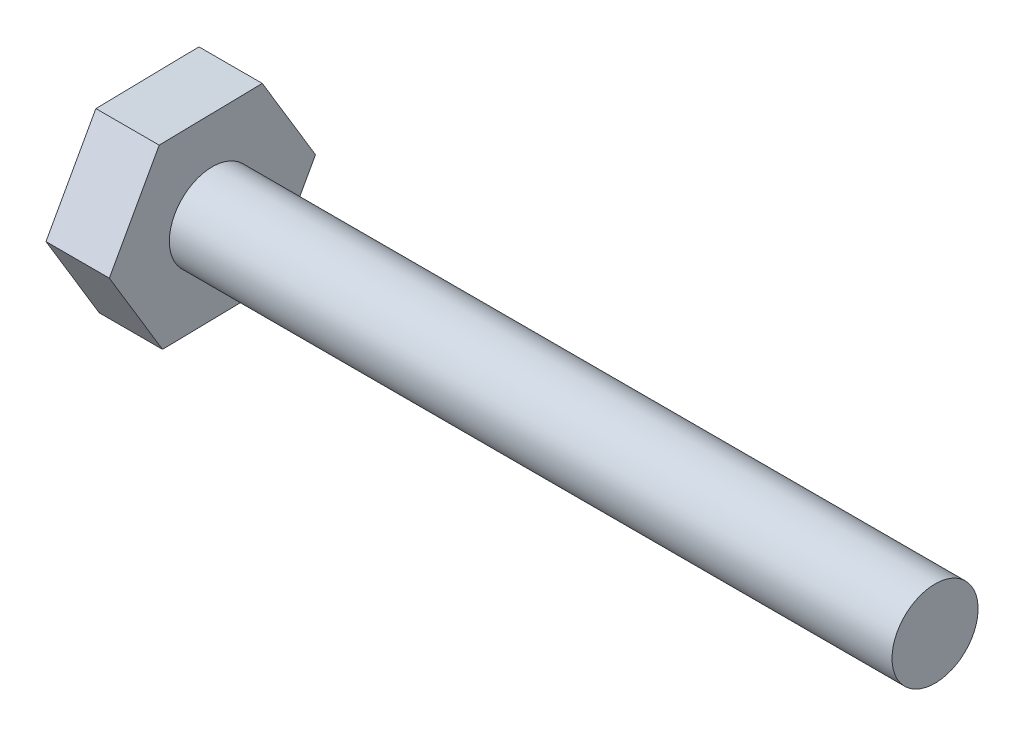
ISO-10303-21;
HEADER;
FILE_DESCRIPTION(('STEP AP214'),'2;1');
FILE_NAME('part.step','',(''),(''),'','','');
FILE_SCHEMA(('AUTOMOTIVE_DESIGN { 1 0 10303 214 1 1 1 1 }'));
ENDSEC;
DATA;
#1=APPLICATION_CONTEXT('core data for automotive mechanical design processes');
#2=APPLICATION_PROTOCOL_DEFINITION('international standard','automotive_design',2000,#1);
#3=PRODUCT_CONTEXT('',#1,'mechanical');
#4=PRODUCT('Part','Part','',(#3));
#5=PRODUCT_RELATED_PRODUCT_CATEGORY('part','',(#4));
#6=PRODUCT_DEFINITION_FORMATION('','',#4);
#7=PRODUCT_DEFINITION_CONTEXT('part definition',#1,'design');
#8=PRODUCT_DEFINITION('design','',#6,#7);
#9=PRODUCT_DEFINITION_SHAPE('','',#8);
#10=(LENGTH_UNIT() NAMED_UNIT(*) SI_UNIT(.MILLI.,.METRE.));
#11=(NAMED_UNIT(*) PLANE_ANGLE_UNIT() SI_UNIT($,.RADIAN.));
#12=(NAMED_UNIT(*) SI_UNIT($,.STERADIAN.) SOLID_ANGLE_UNIT());
#13=UNCERTAINTY_MEASURE_WITH_UNIT(LENGTH_MEASURE(1.E-05),#10,'distance_accuracy_value','');
#14=(GEOMETRIC_REPRESENTATION_CONTEXT(3) GLOBAL_UNCERTAINTY_ASSIGNED_CONTEXT((#13)) GLOBAL_UNIT_ASSIGNED_CONTEXT((#10,
#11,#12)) REPRESENTATION_CONTEXT('',''));
#15=CARTESIAN_POINT('',(0.,0.,0.));
#16=DIRECTION('',(0.,0.,1.));
#17=DIRECTION('',(1.,0.,0.));
#18=AXIS2_PLACEMENT_3D('',#15,#16,#17);
#19=CARTESIAN_POINT('',(0.,0.,0.));
#20=DIRECTION('',(1.,0.,0.));
#21=DIRECTION('',(0.,0.,-1.));
#22=AXIS2_PLACEMENT_3D('',#19,#20,#21);
#23=PLANE('',#22);
#24=DIRECTION('',(0.,-0.856501290352966,-0.51614488239612));
#25=VECTOR('',#24,1.);
#26=CARTESIAN_POINT('',(0.,-3.57688403500511,5.93555394214605));
#27=LINE('',#26,#25);
#28=CARTESIAN_POINT('',(0.,-0.149990368717544,8.00066890261633));
#29=VERTEX_POINT('',#28);
#30=CARTESIAN_POINT('',(0.,-7.00377770129268,3.87043898167577));
#31=VERTEX_POINT('',#30);
#32=EDGE_CURVE('E203',#29,#31,#27,.T.);
#33=ORIENTED_EDGE('',*,*,#32,.F.);
#34=DIRECTION('',(0.,-0.875245225364854,0.48367943462176));
#35=VECTOR('',#34,1.);
#36=CARTESIAN_POINT('',(0.,3.35189848192879,6.06544941177844));
#37=LINE('',#36,#35);
#38=CARTESIAN_POINT('',(0.,6.85378733257514,4.13022992094055));
#39=VERTEX_POINT('',#38);
#40=EDGE_CURVE('E164',#39,#29,#37,.T.);
#41=ORIENTED_EDGE('',*,*,#40,.F.);
#42=DIRECTION('',(0.,-0.0187439350118885,0.99982431701788));
#43=VECTOR('',#42,1.);
#44=CARTESIAN_POINT('',(0.,6.92878251693391,0.129895469632387));
#45=LINE('',#44,#43);
#46=CARTESIAN_POINT('',(0.,7.00377770129268,-3.87043898167577));
#47=VERTEX_POINT('',#46);
#48=EDGE_CURVE('E158',#47,#39,#45,.T.);
#49=ORIENTED_EDGE('',*,*,#48,.F.);
#50=DIRECTION('',(0.,0.856501290352966,0.51614488239612));
#51=VECTOR('',#50,1.);
#52=CARTESIAN_POINT('',(0.,3.57688403500511,-5.93555394214605));
#53=LINE('',#52,#51);
#54=CARTESIAN_POINT('',(0.,0.149990368717546,-8.00066890261633));
#55=VERTEX_POINT('',#54);
#56=EDGE_CURVE('E193',#55,#47,#53,.T.);
#57=ORIENTED_EDGE('',*,*,#56,.F.);
#58=DIRECTION('',(0.,0.875245225364855,-0.483679434621759));
#59=VECTOR('',#58,1.);
#60=CARTESIAN_POINT('',(0.,-3.35189848192879,-6.06544941177844));
#61=LINE('',#60,#59);
#62=CARTESIAN_POINT('',(0.,-6.85378733257513,-4.13022992094056));
#63=VERTEX_POINT('',#62);
#64=EDGE_CURVE('E208',#63,#55,#61,.T.);
#65=ORIENTED_EDGE('',*,*,#64,.F.);
#66=DIRECTION('',(0.,0.0187439350118889,-0.99982431701788));
#67=VECTOR('',#66,1.);
#68=CARTESIAN_POINT('',(0.,-6.92878251693391,-0.12989546963239));
#69=LINE('',#68,#67);
#70=EDGE_CURVE('E206',#31,#63,#69,.T.);
#71=ORIENTED_EDGE('',*,*,#70,.F.);
#72=EDGE_LOOP('',(#33,#41,#49,#57,#65,#71));
#73=FACE_BOUND('',#72,.T.);
#74=ADVANCED_FACE('F117',(#73),#23,.F.);
#75=CARTESIAN_POINT('',(4.91383112753295,-6.92878251693391,-0.12989546963239));
#76=DIRECTION('',(0.,0.99982431701788,0.0187439350118888));
#77=DIRECTION('',(0.,-0.0187439350118888,0.99982431701788));
#78=AXIS2_PLACEMENT_3D('',#75,#76,#77);
#79=PLANE('',#78);
#80=ORIENTED_EDGE('',*,*,#70,.T.);
#81=DIRECTION('',(-1.,0.,0.));
#82=VECTOR('',#81,1.);
#83=CARTESIAN_POINT('',(4.91383112753295,-6.85378733257513,-4.13022992094056));
#84=LINE('',#83,#82);
#85=CARTESIAN_POINT('',(4.91383112753295,-6.85378733257513,-4.13022992094056));
#86=VERTEX_POINT('',#85);
#87=EDGE_CURVE('E127',#86,#63,#84,.T.);
#88=ORIENTED_EDGE('',*,*,#87,.F.);
#89=DIRECTION('',(0.,0.0187439350118889,-0.99982431701788));
#90=VECTOR('',#89,1.);
#91=CARTESIAN_POINT('',(4.91383112753295,-6.92878251693391,-0.12989546963239));
#92=LINE('',#91,#90);
#93=CARTESIAN_POINT('',(4.91383112753295,-7.00377770129268,3.87043898167577));
#94=VERTEX_POINT('',#93);
#95=EDGE_CURVE('E172',#94,#86,#92,.T.);
#96=ORIENTED_EDGE('',*,*,#95,.F.);
#97=DIRECTION('',(-1.,0.,0.));
#98=VECTOR('',#97,1.);
#99=CARTESIAN_POINT('',(4.91383112753295,-7.00377770129268,3.87043898167577));
#100=LINE('',#99,#98);
#101=EDGE_CURVE('E12',#94,#31,#100,.T.);
#102=ORIENTED_EDGE('',*,*,#101,.T.);
#103=EDGE_LOOP('',(#80,#88,#96,#102));
#104=FACE_BOUND('',#103,.T.);
#105=ADVANCED_FACE('F247',(#104),#79,.F.);
#106=CARTESIAN_POINT('',(4.91383112753295,-3.35189848192879,-6.06544941177844));
#107=DIRECTION('',(0.,0.483679434621759,0.875245225364855));
#108=DIRECTION('',(0.,-0.875245225364855,0.483679434621759));
#109=AXIS2_PLACEMENT_3D('',#106,#107,#108);
#110=PLANE('',#109);
#111=ORIENTED_EDGE('',*,*,#64,.T.);
#112=DIRECTION('',(-1.,0.,0.));
#113=VECTOR('',#112,1.);
#114=CARTESIAN_POINT('',(4.91383112753295,0.149990368717546,-8.00066890261633));
#115=LINE('',#114,#113);
#116=CARTESIAN_POINT('',(4.91383112753295,0.149990368717546,-8.00066890261633));
#117=VERTEX_POINT('',#116);
#118=EDGE_CURVE('E194',#117,#55,#115,.T.);
#119=ORIENTED_EDGE('',*,*,#118,.F.);
#120=DIRECTION('',(0.,0.875245225364855,-0.483679434621759));
#121=VECTOR('',#120,1.);
#122=CARTESIAN_POINT('',(4.91383112753295,-3.35189848192879,-6.06544941177844));
#123=LINE('',#122,#121);
#124=EDGE_CURVE('E185',#86,#117,#123,.T.);
#125=ORIENTED_EDGE('',*,*,#124,.F.);
#126=ORIENTED_EDGE('',*,*,#87,.T.);
#127=EDGE_LOOP('',(#111,#119,#125,#126));
#128=FACE_BOUND('',#127,.T.);
#129=ADVANCED_FACE('F220',(#128),#110,.F.);
#130=CARTESIAN_POINT('',(4.91383112753295,3.57688403500511,-5.93555394214605));
#131=DIRECTION('',(0.,-0.51614488239612,0.856501290352966));
#132=DIRECTION('',(0.,-0.856501290352966,-0.51614488239612));
#133=AXIS2_PLACEMENT_3D('',#130,#131,#132);
#134=PLANE('',#133);
#135=ORIENTED_EDGE('',*,*,#56,.T.);
#136=DIRECTION('',(-1.,0.,0.));
#137=VECTOR('',#136,1.);
#138=CARTESIAN_POINT('',(4.91383112753295,7.00377770129268,-3.87043898167577));
#139=LINE('',#138,#137);
#140=CARTESIAN_POINT('',(4.91383112753295,7.00377770129268,-3.87043898167577));
#141=VERTEX_POINT('',#140);
#142=EDGE_CURVE('E190',#141,#47,#139,.T.);
#143=ORIENTED_EDGE('',*,*,#142,.F.);
#144=DIRECTION('',(0.,0.856501290352966,0.51614488239612));
#145=VECTOR('',#144,1.);
#146=CARTESIAN_POINT('',(4.91383112753295,3.57688403500511,-5.93555394214605));
#147=LINE('',#146,#145);
#148=EDGE_CURVE('E179',#117,#141,#147,.T.);
#149=ORIENTED_EDGE('',*,*,#148,.F.);
#150=ORIENTED_EDGE('',*,*,#118,.T.);
#151=EDGE_LOOP('',(#135,#143,#149,#150));
#152=FACE_BOUND('',#151,.T.);
#153=ADVANCED_FACE('F191',(#152),#134,.F.);
#154=CARTESIAN_POINT('',(4.91383112753295,6.92878251693391,0.129895469632387));
#155=DIRECTION('',(0.,-0.99982431701788,-0.0187439350118885));
#156=DIRECTION('',(0.,0.0187439350118885,-0.99982431701788));
#157=AXIS2_PLACEMENT_3D('',#154,#155,#156);
#158=PLANE('',#157);
#159=ORIENTED_EDGE('',*,*,#48,.T.);
#160=DIRECTION('',(-1.,0.,0.));
#161=VECTOR('',#160,1.);
#162=CARTESIAN_POINT('',(4.91383112753295,6.85378733257514,4.13022992094055));
#163=LINE('',#162,#161);
#164=CARTESIAN_POINT('',(4.91383112753295,6.85378733257514,4.13022992094055));
#165=VERTEX_POINT('',#164);
#166=EDGE_CURVE('E195',#165,#39,#163,.T.);
#167=ORIENTED_EDGE('',*,*,#166,.F.);
#168=DIRECTION('',(0.,-0.0187439350118885,0.99982431701788));
#169=VECTOR('',#168,1.);
#170=CARTESIAN_POINT('',(4.91383112753295,6.92878251693391,0.129895469632387));
#171=LINE('',#170,#169);
#172=EDGE_CURVE('E183',#141,#165,#171,.T.);
#173=ORIENTED_EDGE('',*,*,#172,.F.);
#174=ORIENTED_EDGE('',*,*,#142,.T.);
#175=EDGE_LOOP('',(#159,#167,#173,#174));
#176=FACE_BOUND('',#175,.T.);
#177=ADVANCED_FACE('F197',(#176),#158,.F.);
#178=CARTESIAN_POINT('',(4.91383112753295,3.35189848192879,6.06544941177844));
#179=DIRECTION('',(0.,-0.48367943462176,-0.875245225364854));
#180=DIRECTION('',(0.,0.875245225364855,-0.48367943462176));
#181=AXIS2_PLACEMENT_3D('',#178,#179,#180);
#182=PLANE('',#181);
#183=ORIENTED_EDGE('',*,*,#40,.T.);
#184=DIRECTION('',(-1.,0.,0.));
#185=VECTOR('',#184,1.);
#186=CARTESIAN_POINT('',(4.91383112753295,-0.149990368717544,8.00066890261633));
#187=LINE('',#186,#185);
#188=CARTESIAN_POINT('',(4.91383112753295,-0.149990368717544,8.00066890261633));
#189=VERTEX_POINT('',#188);
#190=EDGE_CURVE('E199',#189,#29,#187,.T.);
#191=ORIENTED_EDGE('',*,*,#190,.F.);
#192=DIRECTION('',(0.,-0.875245225364854,0.48367943462176));
#193=VECTOR('',#192,1.);
#194=CARTESIAN_POINT('',(4.91383112753295,3.35189848192879,6.06544941177844));
#195=LINE('',#194,#193);
#196=EDGE_CURVE('E135',#165,#189,#195,.T.);
#197=ORIENTED_EDGE('',*,*,#196,.F.);
#198=ORIENTED_EDGE('',*,*,#166,.T.);
#199=EDGE_LOOP('',(#183,#191,#197,#198));
#200=FACE_BOUND('',#199,.T.);
#201=ADVANCED_FACE('F226',(#200),#182,.F.);
#202=CARTESIAN_POINT('',(4.91383112753295,-3.57688403500511,5.93555394214605));
#203=DIRECTION('',(0.,0.51614488239612,-0.856501290352966));
#204=DIRECTION('',(0.,0.856501290352966,0.51614488239612));
#205=AXIS2_PLACEMENT_3D('',#202,#203,#204);
#206=PLANE('',#205);
#207=ORIENTED_EDGE('',*,*,#32,.T.);
#208=ORIENTED_EDGE('',*,*,#101,.F.);
#209=DIRECTION('',(0.,-0.856501290352966,-0.51614488239612));
#210=VECTOR('',#209,1.);
#211=CARTESIAN_POINT('',(4.91383112753295,-3.57688403500511,5.93555394214605));
#212=LINE('',#211,#210);
#213=EDGE_CURVE('E213',#189,#94,#212,.T.);
#214=ORIENTED_EDGE('',*,*,#213,.F.);
#215=ORIENTED_EDGE('',*,*,#190,.T.);
#216=EDGE_LOOP('',(#207,#208,#214,#215));
#217=FACE_BOUND('',#216,.T.);
#218=ADVANCED_FACE('F119',(#217),#206,.F.);
#219=CARTESIAN_POINT('',(4.91383112753295,0.,0.));
#220=DIRECTION('',(1.,0.,0.));
#221=DIRECTION('',(0.,0.,-1.));
#222=AXIS2_PLACEMENT_3D('',#219,#220,#221);
#223=PLANE('',#222);
#224=CARTESIAN_POINT('',(4.91383112753295,0.,0.));
#225=DIRECTION('',(1.,0.,0.));
#226=DIRECTION('',(0.,0.,-1.));
#227=AXIS2_PLACEMENT_3D('',#224,#225,#226);
#228=CIRCLE('',#227,3.34);
#229=CARTESIAN_POINT('',(4.91383112753294,0.,3.34));
#230=VERTEX_POINT('',#229);
#231=EDGE_CURVE('E121',#230,#230,#228,.F.);
#232=ORIENTED_EDGE('',*,*,#231,.T.);
#233=EDGE_LOOP('',(#232));
#234=FACE_BOUND('',#233,.T.);
#235=ORIENTED_EDGE('',*,*,#213,.T.);
#236=ORIENTED_EDGE('',*,*,#95,.T.);
#237=ORIENTED_EDGE('',*,*,#124,.T.);
#238=ORIENTED_EDGE('',*,*,#148,.T.);
#239=ORIENTED_EDGE('',*,*,#172,.T.);
#240=ORIENTED_EDGE('',*,*,#196,.T.);
#241=EDGE_LOOP('',(#235,#236,#237,#238,#239,#240));
#242=FACE_BOUND('',#241,.T.);
#243=ADVANCED_FACE('F181',(#234,#242),#223,.T.);
#244=CARTESIAN_POINT('',(61.,0.,0.));
#245=DIRECTION('',(-1.,0.,0.));
#246=DIRECTION('',(0.,0.,1.));
#247=AXIS2_PLACEMENT_3D('',#244,#245,#246);
#248=CYLINDRICAL_SURFACE('',#247,3.34);
#249=CARTESIAN_POINT('',(61.,0.,0.));
#250=DIRECTION('',(1.,0.,0.));
#251=DIRECTION('',(0.,0.,-1.));
#252=AXIS2_PLACEMENT_3D('',#249,#250,#251);
#253=CIRCLE('',#252,3.34);
#254=CARTESIAN_POINT('',(61.,0.,3.34));
#255=VERTEX_POINT('',#254);
#256=EDGE_CURVE('E308',#255,#255,#253,.T.);
#257=CARTESIAN_POINT('',(4.91383112753294,0.,3.34));
#258=CARTESIAN_POINT('',(5.49806205328781,0.,3.34));
#259=CARTESIAN_POINT('',(6.08229297904267,0.,3.34));
#260=CARTESIAN_POINT('',(7.2507548305524,0.,3.34));
#261=CARTESIAN_POINT('',(7.83498575630727,0.,3.34));
#262=CARTESIAN_POINT('',(9.003447607817,0.,3.34));
#263=CARTESIAN_POINT('',(9.58767853357186,0.,3.34));
#264=CARTESIAN_POINT('',(10.7561403850816,0.,3.34));
#265=CARTESIAN_POINT('',(11.3403713108365,0.,3.34));
#266=CARTESIAN_POINT('',(12.5088331623462,0.,3.34));
#267=CARTESIAN_POINT('',(13.0930640881011,0.,3.34));
#268=CARTESIAN_POINT('',(14.2615259396108,0.,3.34));
#269=CARTESIAN_POINT('',(14.8457568653657,0.,3.34));
#270=CARTESIAN_POINT('',(16.0142187168754,0.,3.34));
#271=CARTESIAN_POINT('',(16.5984496426302,0.,3.34));
#272=CARTESIAN_POINT('',(17.76691149414,0.,3.34));
#273=CARTESIAN_POINT('',(18.3511424198948,0.,3.34));
#274=CARTESIAN_POINT('',(19.5196042714046,0.,3.34));
#275=CARTESIAN_POINT('',(20.1038351971594,0.,3.34));
#276=CARTESIAN_POINT('',(21.2722970486692,0.,3.34));
#277=CARTESIAN_POINT('',(21.856527974424,0.,3.34));
#278=CARTESIAN_POINT('',(23.0249898259338,0.,3.34));
#279=CARTESIAN_POINT('',(23.6092207516886,0.,3.34));
#280=CARTESIAN_POINT('',(24.7776826031984,0.,3.34));
#281=CARTESIAN_POINT('',(25.3619135289532,0.,3.34));
#282=CARTESIAN_POINT('',(26.530375380463,0.,3.34));
#283=CARTESIAN_POINT('',(27.1146063062178,0.,3.34));
#284=CARTESIAN_POINT('',(28.2830681577276,0.,3.34));
#285=CARTESIAN_POINT('',(28.8672990834824,0.,3.34));
#286=CARTESIAN_POINT('',(30.0357609349921,0.,3.34));
#287=CARTESIAN_POINT('',(30.619991860747,0.,3.34));
#288=CARTESIAN_POINT('',(31.7884537122567,0.,3.34));
#289=CARTESIAN_POINT('',(32.3726846380116,0.,3.34));
#290=CARTESIAN_POINT('',(33.5411464895213,0.,3.34));
#291=CARTESIAN_POINT('',(34.1253774152762,0.,3.34));
#292=CARTESIAN_POINT('',(35.2938392667859,0.,3.34));
#293=CARTESIAN_POINT('',(35.8780701925408,0.,3.34));
#294=CARTESIAN_POINT('',(37.0465320440505,0.,3.34));
#295=CARTESIAN_POINT('',(37.6307629698054,0.,3.34));
#296=CARTESIAN_POINT('',(38.7992248213151,0.,3.34));
#297=CARTESIAN_POINT('',(39.38345574707,0.,3.34));
#298=CARTESIAN_POINT('',(40.5519175985797,0.,3.34));
#299=CARTESIAN_POINT('',(41.1361485243346,0.,3.34));
#300=CARTESIAN_POINT('',(42.3046103758443,0.,3.34));
#301=CARTESIAN_POINT('',(42.8888413015992,0.,3.34));
#302=CARTESIAN_POINT('',(44.0573031531089,0.,3.34));
#303=CARTESIAN_POINT('',(44.6415340788638,0.,3.34));
#304=CARTESIAN_POINT('',(45.8099959303735,0.,3.34));
#305=CARTESIAN_POINT('',(46.3942268561284,0.,3.34));
#306=CARTESIAN_POINT('',(47.5626887076381,0.,3.34));
#307=CARTESIAN_POINT('',(48.146919633393,0.,3.34));
#308=CARTESIAN_POINT('',(49.3153814849027,0.,3.34));
#309=CARTESIAN_POINT('',(49.8996124106576,0.,3.34));
#310=CARTESIAN_POINT('',(51.0680742621673,0.,3.34));
#311=CARTESIAN_POINT('',(51.6523051879222,0.,3.34));
#312=CARTESIAN_POINT('',(52.8207670394319,0.,3.34));
#313=CARTESIAN_POINT('',(53.4049979651867,0.,3.34));
#314=CARTESIAN_POINT('',(54.5734598166965,0.,3.34));
#315=CARTESIAN_POINT('',(55.1576907424513,0.,3.34));
#316=CARTESIAN_POINT('',(56.3261525939611,0.,3.34));
#317=CARTESIAN_POINT('',(56.9103835197159,0.,3.34));
#318=CARTESIAN_POINT('',(58.0788453712257,0.,3.34));
#319=CARTESIAN_POINT('',(58.6630762969805,0.,3.34));
#320=CARTESIAN_POINT('',(59.8315381484903,0.,3.34));
#321=CARTESIAN_POINT('',(60.4157690742451,0.,3.34));
#322=CARTESIAN_POINT('',(61.,0.,3.34));
#323=B_SPLINE_CURVE_WITH_KNOTS('',3,(#257,#258,#259,#260,#261,#262,#263,#264,#265,#266,#267,
#268,#269,#270,#271,#272,#273,#274,#275,#276,#277,#278,#279,#280,#281,#282,#283,#284,#285,#286,
#287,#288,#289,#290,#291,#292,#293,#294,#295,#296,#297,#298,#299,#300,#301,#302,#303,#304,#305,
#306,#307,#308,#309,#310,#311,#312,#313,#314,#315,#316,#317,#318,#319,#320,#321,#322),
.UNSPECIFIED.,.F.,.F.,(4,2,2,2,2,2,2,2,2,2,2,2,2,2,2,2,2,2,2,2,2,2,2,2,2,2,2,2,2,2,2,2,4),(0.,
1.75269277726459,3.50538555452919,5.25807833179379,7.01077110905839,8.76346388632298,
10.5161566635876,12.2688494408522,14.0215422181168,15.7742349953814,17.526927772646,
19.2796205499106,21.0323133271751,22.7850061044397,24.5376988817043,26.2903916589689,
28.0430844362335,29.7957772134981,31.5484699907627,33.3011627680273,35.0538555452919,
36.8065483225565,38.5592410998211,40.3119338770857,42.0646266543503,43.8173194316149,
45.5700122088795,47.3227049861441,49.0753977634087,50.8280905406733,52.5807833179379,
54.3334760952025,56.0861688724671),.UNSPECIFIED.);
#324=EDGE_CURVE('BSEAM233',#230,#255,#323,.T.);
#325=ORIENTED_EDGE('',*,*,#231,.F.);
#326=ORIENTED_EDGE('',*,*,#256,.F.);
#327=ORIENTED_EDGE('',*,*,#324,.T.);
#328=ORIENTED_EDGE('',*,*,#324,.F.);
#329=EDGE_LOOP('',(#325,#327,#326,#328));
#330=FACE_BOUND('',#329,.T.);
#331=ADVANCED_FACE('F233',(#330),#248,.T.);
#332=CARTESIAN_POINT('',(61.,0.,0.));
#333=DIRECTION('',(1.,0.,0.));
#334=DIRECTION('',(0.,0.,-1.));
#335=AXIS2_PLACEMENT_3D('',#332,#333,#334);
#336=PLANE('',#335);
#337=ORIENTED_EDGE('',*,*,#256,.T.);
#338=EDGE_LOOP('',(#337));
#339=FACE_BOUND('',#338,.T.);
#340=ADVANCED_FACE('F242',(#339),#336,.T.);
#341=CLOSED_SHELL('',(#74,#105,#129,#153,#177,#201,#218,#243,#331,#340));
#342=MANIFOLD_SOLID_BREP('B2',#341);
#343=ADVANCED_BREP_SHAPE_REPRESENTATION('',(#18,#342),#14);
#344=SHAPE_DEFINITION_REPRESENTATION(#9,#343);
ENDSEC;
END-ISO-10303-21;
